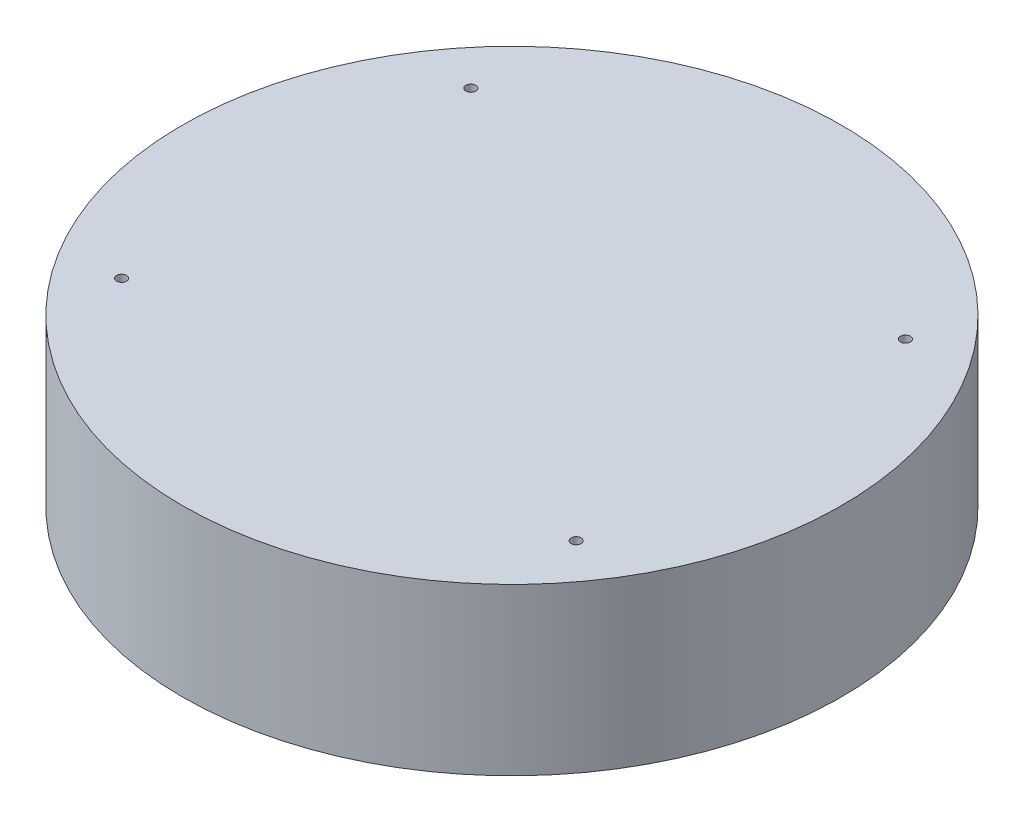
ISO-10303-21;
HEADER;
FILE_DESCRIPTION(('STEP AP214'),'2;1');
FILE_NAME('part.step','',(''),(''),'','','');
FILE_SCHEMA(('AUTOMOTIVE_DESIGN { 1 0 10303 214 1 1 1 1 }'));
ENDSEC;
DATA;
#1=APPLICATION_CONTEXT('core data for automotive mechanical design processes');
#2=APPLICATION_PROTOCOL_DEFINITION('international standard','automotive_design',2000,#1);
#3=PRODUCT_CONTEXT('',#1,'mechanical');
#4=PRODUCT('Part','Part','',(#3));
#5=PRODUCT_RELATED_PRODUCT_CATEGORY('part','',(#4));
#6=PRODUCT_DEFINITION_FORMATION('','',#4);
#7=PRODUCT_DEFINITION_CONTEXT('part definition',#1,'design');
#8=PRODUCT_DEFINITION('design','',#6,#7);
#9=PRODUCT_DEFINITION_SHAPE('','',#8);
#10=(LENGTH_UNIT() NAMED_UNIT(*) SI_UNIT(.MILLI.,.METRE.));
#11=(NAMED_UNIT(*) PLANE_ANGLE_UNIT() SI_UNIT($,.RADIAN.));
#12=(NAMED_UNIT(*) SI_UNIT($,.STERADIAN.) SOLID_ANGLE_UNIT());
#13=UNCERTAINTY_MEASURE_WITH_UNIT(LENGTH_MEASURE(1.E-05),#10,'distance_accuracy_value','');
#14=(GEOMETRIC_REPRESENTATION_CONTEXT(3) GLOBAL_UNCERTAINTY_ASSIGNED_CONTEXT((#13)) GLOBAL_UNIT_ASSIGNED_CONTEXT((#10,
#11,#12)) REPRESENTATION_CONTEXT('',''));
#15=CARTESIAN_POINT('',(0.,0.,0.));
#16=DIRECTION('',(0.,0.,1.));
#17=DIRECTION('',(1.,0.,0.));
#18=AXIS2_PLACEMENT_3D('',#15,#16,#17);
#19=CARTESIAN_POINT('',(0.,82.94,0.));
#20=DIRECTION('',(0.,-1.,0.));
#21=DIRECTION('',(0.,0.,-1.));
#22=AXIS2_PLACEMENT_3D('',#19,#20,#21);
#23=CYLINDRICAL_SURFACE('',#22,164.95);
#24=CARTESIAN_POINT('',(0.,82.94,0.));
#25=DIRECTION('',(0.,1.,0.));
#26=DIRECTION('',(0.,0.,1.));
#27=AXIS2_PLACEMENT_3D('',#24,#25,#26);
#28=CIRCLE('',#27,164.95);
#29=CARTESIAN_POINT('',(0.,82.94,164.95));
#30=VERTEX_POINT('',#29);
#31=EDGE_CURVE('E10',#30,#30,#28,.T.);
#32=ORIENTED_EDGE('',*,*,#31,.F.);
#33=EDGE_LOOP('',(#32));
#34=FACE_BOUND('',#33,.T.);
#35=CARTESIAN_POINT('',(0.,0.,0.));
#36=DIRECTION('',(0.,1.,0.));
#37=DIRECTION('',(0.,0.,1.));
#38=AXIS2_PLACEMENT_3D('',#35,#36,#37);
#39=CIRCLE('',#38,164.95);
#40=CARTESIAN_POINT('',(0.,0.,164.95));
#41=VERTEX_POINT('',#40);
#42=EDGE_CURVE('E34',#41,#41,#39,.T.);
#43=ORIENTED_EDGE('',*,*,#42,.T.);
#44=EDGE_LOOP('',(#43));
#45=FACE_BOUND('',#44,.T.);
#46=ADVANCED_FACE('F31',(#34,#45),#23,.T.);
#47=CARTESIAN_POINT('',(0.,82.94,0.));
#48=DIRECTION('',(0.,1.,0.));
#49=DIRECTION('',(0.,0.,1.));
#50=AXIS2_PLACEMENT_3D('',#47,#48,#49);
#51=PLANE('',#50);
#52=CARTESIAN_POINT('',(108.75,82.94,-88.1670998729118));
#53=DIRECTION('',(0.,1.,0.));
#54=DIRECTION('',(0.,0.,1.));
#55=AXIS2_PLACEMENT_3D('',#52,#53,#54);
#56=CIRCLE('',#55,2.50000000000001);
#57=CARTESIAN_POINT('',(108.75,82.94,-85.6670998729118));
#58=VERTEX_POINT('',#57);
#59=EDGE_CURVE('E46',#58,#58,#56,.T.);
#60=ORIENTED_EDGE('',*,*,#59,.F.);
#61=EDGE_LOOP('',(#60));
#62=FACE_BOUND('',#61,.T.);
#63=CARTESIAN_POINT('',(113.75,82.94,81.6145667145271));
#64=DIRECTION('',(0.,1.,0.));
#65=DIRECTION('',(0.,0.,1.));
#66=AXIS2_PLACEMENT_3D('',#63,#64,#65);
#67=CIRCLE('',#66,2.50000000000001);
#68=CARTESIAN_POINT('',(113.75,82.94,84.1145667145272));
#69=VERTEX_POINT('',#68);
#70=EDGE_CURVE('E58',#69,#69,#67,.T.);
#71=ORIENTED_EDGE('',*,*,#70,.F.);
#72=EDGE_LOOP('',(#71));
#73=FACE_BOUND('',#72,.T.);
#74=CARTESIAN_POINT('',(-113.75,82.94,81.6145667145271));
#75=DIRECTION('',(0.,1.,0.));
#76=DIRECTION('',(0.,0.,1.));
#77=AXIS2_PLACEMENT_3D('',#74,#75,#76);
#78=CIRCLE('',#77,2.50000000000001);
#79=CARTESIAN_POINT('',(-113.75,82.94,84.1145667145272));
#80=VERTEX_POINT('',#79);
#81=EDGE_CURVE('E52',#80,#80,#78,.T.);
#82=ORIENTED_EDGE('',*,*,#81,.F.);
#83=EDGE_LOOP('',(#82));
#84=FACE_BOUND('',#83,.T.);
#85=CARTESIAN_POINT('',(-108.75,82.94,-88.1670998729118));
#86=DIRECTION('',(0.,1.,0.));
#87=DIRECTION('',(0.,0.,1.));
#88=AXIS2_PLACEMENT_3D('',#85,#86,#87);
#89=CIRCLE('',#88,2.50000000000001);
#90=CARTESIAN_POINT('',(-108.75,82.94,-85.6670998729118));
#91=VERTEX_POINT('',#90);
#92=EDGE_CURVE('E43',#91,#91,#89,.T.);
#93=ORIENTED_EDGE('',*,*,#92,.F.);
#94=EDGE_LOOP('',(#93));
#95=FACE_BOUND('',#94,.T.);
#96=ORIENTED_EDGE('',*,*,#31,.T.);
#97=EDGE_LOOP('',(#96));
#98=FACE_BOUND('',#97,.T.);
#99=ADVANCED_FACE('F69',(#62,#73,#84,#95,#98),#51,.T.);
#100=CARTESIAN_POINT('',(0.,0.,0.));
#101=DIRECTION('',(0.,1.,0.));
#102=DIRECTION('',(0.,0.,1.));
#103=AXIS2_PLACEMENT_3D('',#100,#101,#102);
#104=PLANE('',#103);
#105=ORIENTED_EDGE('',*,*,#42,.F.);
#106=EDGE_LOOP('',(#105));
#107=FACE_BOUND('',#106,.T.);
#108=ADVANCED_FACE('F72',(#107),#104,.F.);
#109=CARTESIAN_POINT('',(-108.75,77.94,-88.1670998729118));
#110=DIRECTION('',(0.,1.,0.));
#111=DIRECTION('',(0.,0.,1.));
#112=AXIS2_PLACEMENT_3D('',#109,#110,#111);
#113=CYLINDRICAL_SURFACE('',#112,2.50000000000001);
#114=CARTESIAN_POINT('',(-108.75,77.94,-88.1670998729118));
#115=DIRECTION('',(0.,1.,0.));
#116=DIRECTION('',(0.,0.,1.));
#117=AXIS2_PLACEMENT_3D('',#114,#115,#116);
#118=CIRCLE('',#117,2.50000000000001);
#119=CARTESIAN_POINT('',(-108.75,77.94,-85.6670998729118));
#120=VERTEX_POINT('',#119);
#121=EDGE_CURVE('E41',#120,#120,#118,.T.);
#122=ORIENTED_EDGE('',*,*,#121,.F.);
#123=EDGE_LOOP('',(#122));
#124=FACE_BOUND('',#123,.T.);
#125=ORIENTED_EDGE('',*,*,#92,.T.);
#126=EDGE_LOOP('',(#125));
#127=FACE_BOUND('',#126,.T.);
#128=ADVANCED_FACE('F80',(#124,#127),#113,.F.);
#129=CARTESIAN_POINT('',(-108.75,77.94,-88.1670998729118));
#130=DIRECTION('',(0.,1.,0.));
#131=DIRECTION('',(0.,0.,1.));
#132=AXIS2_PLACEMENT_3D('',#129,#130,#131);
#133=PLANE('',#132);
#134=ORIENTED_EDGE('',*,*,#121,.T.);
#135=EDGE_LOOP('',(#134));
#136=FACE_BOUND('',#135,.T.);
#137=ADVANCED_FACE('F82',(#136),#133,.T.);
#138=CARTESIAN_POINT('',(-113.75,77.94,81.6145667145271));
#139=DIRECTION('',(0.,1.,0.));
#140=DIRECTION('',(0.,0.,1.));
#141=AXIS2_PLACEMENT_3D('',#138,#139,#140);
#142=CYLINDRICAL_SURFACE('',#141,2.50000000000001);
#143=CARTESIAN_POINT('',(-113.75,77.94,81.6145667145271));
#144=DIRECTION('',(0.,1.,0.));
#145=DIRECTION('',(0.,0.,1.));
#146=AXIS2_PLACEMENT_3D('',#143,#144,#145);
#147=CIRCLE('',#146,2.50000000000001);
#148=CARTESIAN_POINT('',(-113.75,77.94,84.1145667145272));
#149=VERTEX_POINT('',#148);
#150=EDGE_CURVE('E49',#149,#149,#147,.T.);
#151=ORIENTED_EDGE('',*,*,#150,.F.);
#152=EDGE_LOOP('',(#151));
#153=FACE_BOUND('',#152,.T.);
#154=ORIENTED_EDGE('',*,*,#81,.T.);
#155=EDGE_LOOP('',(#154));
#156=FACE_BOUND('',#155,.T.);
#157=ADVANCED_FACE('F89',(#153,#156),#142,.F.);
#158=CARTESIAN_POINT('',(-113.75,77.94,81.6145667145271));
#159=DIRECTION('',(0.,1.,0.));
#160=DIRECTION('',(0.,0.,1.));
#161=AXIS2_PLACEMENT_3D('',#158,#159,#160);
#162=PLANE('',#161);
#163=ORIENTED_EDGE('',*,*,#150,.T.);
#164=EDGE_LOOP('',(#163));
#165=FACE_BOUND('',#164,.T.);
#166=ADVANCED_FACE('F129',(#165),#162,.T.);
#167=CARTESIAN_POINT('',(113.75,77.94,81.6145667145271));
#168=DIRECTION('',(0.,1.,0.));
#169=DIRECTION('',(0.,0.,1.));
#170=AXIS2_PLACEMENT_3D('',#167,#168,#169);
#171=CYLINDRICAL_SURFACE('',#170,2.50000000000001);
#172=CARTESIAN_POINT('',(113.75,77.94,81.6145667145271));
#173=DIRECTION('',(0.,1.,0.));
#174=DIRECTION('',(0.,0.,1.));
#175=AXIS2_PLACEMENT_3D('',#172,#173,#174);
#176=CIRCLE('',#175,2.50000000000001);
#177=CARTESIAN_POINT('',(113.75,77.94,84.1145667145272));
#178=VERTEX_POINT('',#177);
#179=EDGE_CURVE('E55',#178,#178,#176,.T.);
#180=ORIENTED_EDGE('',*,*,#179,.F.);
#181=EDGE_LOOP('',(#180));
#182=FACE_BOUND('',#181,.T.);
#183=ORIENTED_EDGE('',*,*,#70,.T.);
#184=EDGE_LOOP('',(#183));
#185=FACE_BOUND('',#184,.T.);
#186=ADVANCED_FACE('F138',(#182,#185),#171,.F.);
#187=CARTESIAN_POINT('',(113.75,77.94,81.6145667145271));
#188=DIRECTION('',(0.,1.,0.));
#189=DIRECTION('',(0.,0.,1.));
#190=AXIS2_PLACEMENT_3D('',#187,#188,#189);
#191=PLANE('',#190);
#192=ORIENTED_EDGE('',*,*,#179,.T.);
#193=EDGE_LOOP('',(#192));
#194=FACE_BOUND('',#193,.T.);
#195=ADVANCED_FACE('F147',(#194),#191,.T.);
#196=CARTESIAN_POINT('',(108.75,77.94,-88.1670998729118));
#197=DIRECTION('',(0.,1.,0.));
#198=DIRECTION('',(0.,0.,1.));
#199=AXIS2_PLACEMENT_3D('',#196,#197,#198);
#200=CYLINDRICAL_SURFACE('',#199,2.50000000000001);
#201=CARTESIAN_POINT('',(108.75,77.94,-88.1670998729118));
#202=DIRECTION('',(0.,1.,0.));
#203=DIRECTION('',(0.,0.,1.));
#204=AXIS2_PLACEMENT_3D('',#201,#202,#203);
#205=CIRCLE('',#204,2.50000000000001);
#206=CARTESIAN_POINT('',(108.75,77.94,-85.6670998729118));
#207=VERTEX_POINT('',#206);
#208=EDGE_CURVE('E61',#207,#207,#205,.T.);
#209=ORIENTED_EDGE('',*,*,#208,.F.);
#210=EDGE_LOOP('',(#209));
#211=FACE_BOUND('',#210,.T.);
#212=ORIENTED_EDGE('',*,*,#59,.T.);
#213=EDGE_LOOP('',(#212));
#214=FACE_BOUND('',#213,.T.);
#215=ADVANCED_FACE('F67',(#211,#214),#200,.F.);
#216=CARTESIAN_POINT('',(108.75,77.94,-88.1670998729118));
#217=DIRECTION('',(0.,1.,0.));
#218=DIRECTION('',(0.,0.,1.));
#219=AXIS2_PLACEMENT_3D('',#216,#217,#218);
#220=PLANE('',#219);
#221=ORIENTED_EDGE('',*,*,#208,.T.);
#222=EDGE_LOOP('',(#221));
#223=FACE_BOUND('',#222,.T.);
#224=ADVANCED_FACE('F164',(#223),#220,.T.);
#225=CLOSED_SHELL('',(#46,#99,#108,#128,#137,#157,#166,#186,#195,#215,#224));
#226=MANIFOLD_SOLID_BREP('B2',#225);
#227=ADVANCED_BREP_SHAPE_REPRESENTATION('',(#18,#226),#14);
#228=SHAPE_DEFINITION_REPRESENTATION(#9,#227);
ENDSEC;
END-ISO-10303-21;
